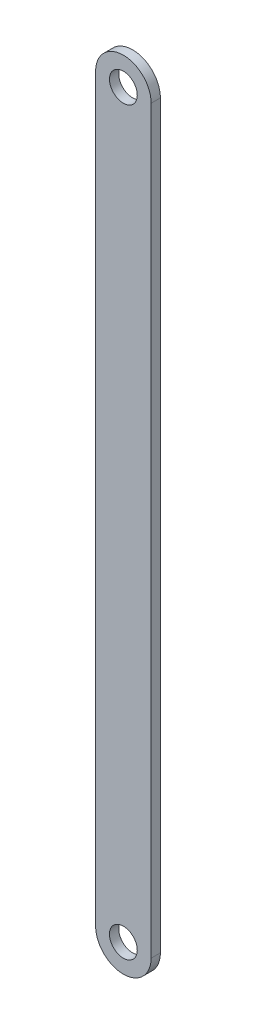
ISO-10303-21;
HEADER;
FILE_DESCRIPTION(('STEP AP214'),'2;1');
FILE_NAME('part.step','',(''),(''),'','','');
FILE_SCHEMA(('AUTOMOTIVE_DESIGN { 1 0 10303 214 1 1 1 1 }'));
ENDSEC;
DATA;
#1=APPLICATION_CONTEXT('core data for automotive mechanical design processes');
#2=APPLICATION_PROTOCOL_DEFINITION('international standard','automotive_design',2000,#1);
#3=PRODUCT_CONTEXT('',#1,'mechanical');
#4=PRODUCT('Part','Part','',(#3));
#5=PRODUCT_RELATED_PRODUCT_CATEGORY('part','',(#4));
#6=PRODUCT_DEFINITION_FORMATION('','',#4);
#7=PRODUCT_DEFINITION_CONTEXT('part definition',#1,'design');
#8=PRODUCT_DEFINITION('design','',#6,#7);
#9=PRODUCT_DEFINITION_SHAPE('','',#8);
#10=(LENGTH_UNIT() NAMED_UNIT(*) SI_UNIT(.MILLI.,.METRE.));
#11=(NAMED_UNIT(*) PLANE_ANGLE_UNIT() SI_UNIT($,.RADIAN.));
#12=(NAMED_UNIT(*) SI_UNIT($,.STERADIAN.) SOLID_ANGLE_UNIT());
#13=UNCERTAINTY_MEASURE_WITH_UNIT(LENGTH_MEASURE(1.E-05),#10,'distance_accuracy_value','');
#14=(GEOMETRIC_REPRESENTATION_CONTEXT(3) GLOBAL_UNCERTAINTY_ASSIGNED_CONTEXT((#13)) GLOBAL_UNIT_ASSIGNED_CONTEXT((#10,
#11,#12)) REPRESENTATION_CONTEXT('',''));
#15=CARTESIAN_POINT('',(0.,0.,0.));
#16=DIRECTION('',(0.,0.,1.));
#17=DIRECTION('',(1.,0.,0.));
#18=AXIS2_PLACEMENT_3D('',#15,#16,#17);
#19=CARTESIAN_POINT('',(0.,-160.01,2.));
#20=DIRECTION('',(0.,0.,-1.));
#21=DIRECTION('',(-1.,0.,0.));
#22=AXIS2_PLACEMENT_3D('',#19,#20,#21);
#23=PLANE('',#22);
#24=CARTESIAN_POINT('',(0.,-160.01,2.));
#25=DIRECTION('',(0.,0.,1.));
#26=DIRECTION('',(-1.,0.,0.));
#27=AXIS2_PLACEMENT_3D('',#24,#25,#26);
#28=CIRCLE('',#27,6.);
#29=CARTESIAN_POINT('',(-5.99999999999998,-160.01,2.));
#30=VERTEX_POINT('',#29);
#31=CARTESIAN_POINT('',(6.00000000000002,-160.01,2.));
#32=VERTEX_POINT('',#31);
#33=EDGE_CURVE('E85',#30,#32,#28,.T.);
#34=ORIENTED_EDGE('',*,*,#33,.T.);
#35=DIRECTION('',(0.,1.,0.));
#36=VECTOR('',#35,1.);
#37=CARTESIAN_POINT('',(6.00000000000002,0.,2.));
#38=LINE('',#37,#36);
#39=CARTESIAN_POINT('',(6.00000000000002,0.,2.));
#40=VERTEX_POINT('',#39);
#41=EDGE_CURVE('E80',#32,#40,#38,.T.);
#42=ORIENTED_EDGE('',*,*,#41,.T.);
#43=CARTESIAN_POINT('',(0.,0.,2.));
#44=DIRECTION('',(0.,0.,1.));
#45=DIRECTION('',(1.,0.,0.));
#46=AXIS2_PLACEMENT_3D('',#43,#44,#45);
#47=CIRCLE('',#46,6.00000000000002);
#48=CARTESIAN_POINT('',(-6.00000000000002,0.,2.));
#49=VERTEX_POINT('',#48);
#50=EDGE_CURVE('E83',#40,#49,#47,.T.);
#51=ORIENTED_EDGE('',*,*,#50,.T.);
#52=DIRECTION('',(0.,-1.,0.));
#53=VECTOR('',#52,1.);
#54=CARTESIAN_POINT('',(-5.99999999999998,-160.01,2.));
#55=LINE('',#54,#53);
#56=EDGE_CURVE('E50',#49,#30,#55,.T.);
#57=ORIENTED_EDGE('',*,*,#56,.T.);
#58=EDGE_LOOP('',(#34,#42,#51,#57));
#59=FACE_BOUND('',#58,.T.);
#60=CARTESIAN_POINT('',(0.,0.,2.));
#61=DIRECTION('',(0.,0.,1.));
#62=DIRECTION('',(1.,0.,0.));
#63=AXIS2_PLACEMENT_3D('',#60,#61,#62);
#64=CIRCLE('',#63,3.);
#65=CARTESIAN_POINT('',(3.,0.,2.));
#66=VERTEX_POINT('',#65);
#67=EDGE_CURVE('E100',#66,#66,#64,.T.);
#68=ORIENTED_EDGE('',*,*,#67,.F.);
#69=EDGE_LOOP('',(#68));
#70=FACE_BOUND('',#69,.T.);
#71=CARTESIAN_POINT('',(0.,-160.01,2.));
#72=DIRECTION('',(0.,0.,1.));
#73=DIRECTION('',(1.,0.,0.));
#74=AXIS2_PLACEMENT_3D('',#71,#72,#73);
#75=CIRCLE('',#74,3.);
#76=CARTESIAN_POINT('',(3.00000000000002,-160.01,2.));
#77=VERTEX_POINT('',#76);
#78=EDGE_CURVE('E115',#77,#77,#75,.T.);
#79=ORIENTED_EDGE('',*,*,#78,.F.);
#80=EDGE_LOOP('',(#79));
#81=FACE_BOUND('',#80,.T.);
#82=ADVANCED_FACE('F33',(#59,#70,#81),#23,.F.);
#83=CARTESIAN_POINT('',(0.,-160.01,0.));
#84=DIRECTION('',(0.,0.,-1.));
#85=DIRECTION('',(-1.,0.,0.));
#86=AXIS2_PLACEMENT_3D('',#83,#84,#85);
#87=PLANE('',#86);
#88=CARTESIAN_POINT('',(0.,0.,0.));
#89=DIRECTION('',(0.,0.,1.));
#90=DIRECTION('',(1.,0.,0.));
#91=AXIS2_PLACEMENT_3D('',#88,#89,#90);
#92=CIRCLE('',#91,3.);
#93=CARTESIAN_POINT('',(3.,0.,0.));
#94=VERTEX_POINT('',#93);
#95=EDGE_CURVE('E112',#94,#94,#92,.T.);
#96=ORIENTED_EDGE('',*,*,#95,.T.);
#97=EDGE_LOOP('',(#96));
#98=FACE_BOUND('',#97,.T.);
#99=CARTESIAN_POINT('',(0.,-160.01,0.));
#100=DIRECTION('',(0.,0.,1.));
#101=DIRECTION('',(-1.,0.,0.));
#102=AXIS2_PLACEMENT_3D('',#99,#100,#101);
#103=CIRCLE('',#102,6.);
#104=CARTESIAN_POINT('',(-5.99999999999998,-160.01,0.));
#105=VERTEX_POINT('',#104);
#106=CARTESIAN_POINT('',(6.00000000000002,-160.01,0.));
#107=VERTEX_POINT('',#106);
#108=EDGE_CURVE('E97',#105,#107,#103,.T.);
#109=ORIENTED_EDGE('',*,*,#108,.F.);
#110=DIRECTION('',(0.,-1.,0.));
#111=VECTOR('',#110,1.);
#112=CARTESIAN_POINT('',(-5.99999999999998,-160.01,0.));
#113=LINE('',#112,#111);
#114=CARTESIAN_POINT('',(-6.00000000000002,0.,0.));
#115=VERTEX_POINT('',#114);
#116=EDGE_CURVE('E73',#115,#105,#113,.T.);
#117=ORIENTED_EDGE('',*,*,#116,.F.);
#118=CARTESIAN_POINT('',(0.,0.,0.));
#119=DIRECTION('',(0.,0.,1.));
#120=DIRECTION('',(1.,0.,0.));
#121=AXIS2_PLACEMENT_3D('',#118,#119,#120);
#122=CIRCLE('',#121,6.00000000000002);
#123=CARTESIAN_POINT('',(6.00000000000002,0.,0.));
#124=VERTEX_POINT('',#123);
#125=EDGE_CURVE('E67',#124,#115,#122,.T.);
#126=ORIENTED_EDGE('',*,*,#125,.F.);
#127=DIRECTION('',(0.,1.,0.));
#128=VECTOR('',#127,1.);
#129=CARTESIAN_POINT('',(6.00000000000002,0.,0.));
#130=LINE('',#129,#128);
#131=EDGE_CURVE('E89',#107,#124,#130,.T.);
#132=ORIENTED_EDGE('',*,*,#131,.F.);
#133=EDGE_LOOP('',(#109,#117,#126,#132));
#134=FACE_BOUND('',#133,.T.);
#135=CARTESIAN_POINT('',(0.,-160.01,0.));
#136=DIRECTION('',(0.,0.,1.));
#137=DIRECTION('',(1.,0.,0.));
#138=AXIS2_PLACEMENT_3D('',#135,#136,#137);
#139=CIRCLE('',#138,3.);
#140=CARTESIAN_POINT('',(3.00000000000002,-160.01,0.));
#141=VERTEX_POINT('',#140);
#142=EDGE_CURVE('E118',#141,#141,#139,.T.);
#143=ORIENTED_EDGE('',*,*,#142,.T.);
#144=EDGE_LOOP('',(#143));
#145=FACE_BOUND('',#144,.T.);
#146=ADVANCED_FACE('F108',(#98,#134,#145),#87,.T.);
#147=CARTESIAN_POINT('',(0.,-160.01,2.));
#148=DIRECTION('',(0.,0.,-1.));
#149=DIRECTION('',(-1.,0.,0.));
#150=AXIS2_PLACEMENT_3D('',#147,#148,#149);
#151=CYLINDRICAL_SURFACE('',#150,6.);
#152=ORIENTED_EDGE('',*,*,#108,.T.);
#153=DIRECTION('',(0.,0.,-1.));
#154=VECTOR('',#153,1.);
#155=CARTESIAN_POINT('',(6.00000000000002,-160.01,2.));
#156=LINE('',#155,#154);
#157=EDGE_CURVE('E11',#32,#107,#156,.T.);
#158=ORIENTED_EDGE('',*,*,#157,.F.);
#159=ORIENTED_EDGE('',*,*,#33,.F.);
#160=DIRECTION('',(0.,0.,-1.));
#161=VECTOR('',#160,1.);
#162=CARTESIAN_POINT('',(-5.99999999999998,-160.01,2.));
#163=LINE('',#162,#161);
#164=EDGE_CURVE('E93',#30,#105,#163,.T.);
#165=ORIENTED_EDGE('',*,*,#164,.T.);
#166=EDGE_LOOP('',(#152,#158,#159,#165));
#167=FACE_BOUND('',#166,.T.);
#168=ADVANCED_FACE('F35',(#167),#151,.T.);
#169=CARTESIAN_POINT('',(6.00000000000002,0.,2.));
#170=DIRECTION('',(-1.,0.,0.));
#171=DIRECTION('',(0.,0.,1.));
#172=AXIS2_PLACEMENT_3D('',#169,#170,#171);
#173=PLANE('',#172);
#174=ORIENTED_EDGE('',*,*,#131,.T.);
#175=DIRECTION('',(0.,0.,-1.));
#176=VECTOR('',#175,1.);
#177=CARTESIAN_POINT('',(6.00000000000002,0.,2.));
#178=LINE('',#177,#176);
#179=EDGE_CURVE('E42',#40,#124,#178,.T.);
#180=ORIENTED_EDGE('',*,*,#179,.F.);
#181=ORIENTED_EDGE('',*,*,#41,.F.);
#182=ORIENTED_EDGE('',*,*,#157,.T.);
#183=EDGE_LOOP('',(#174,#180,#181,#182));
#184=FACE_BOUND('',#183,.T.);
#185=ADVANCED_FACE('F88',(#184),#173,.F.);
#186=CARTESIAN_POINT('',(0.,0.,2.));
#187=DIRECTION('',(0.,0.,-1.));
#188=DIRECTION('',(-1.,0.,0.));
#189=AXIS2_PLACEMENT_3D('',#186,#187,#188);
#190=CYLINDRICAL_SURFACE('',#189,6.00000000000002);
#191=ORIENTED_EDGE('',*,*,#125,.T.);
#192=DIRECTION('',(0.,0.,-1.));
#193=VECTOR('',#192,1.);
#194=CARTESIAN_POINT('',(-6.00000000000002,0.,2.));
#195=LINE('',#194,#193);
#196=EDGE_CURVE('E90',#49,#115,#195,.T.);
#197=ORIENTED_EDGE('',*,*,#196,.F.);
#198=ORIENTED_EDGE('',*,*,#50,.F.);
#199=ORIENTED_EDGE('',*,*,#179,.T.);
#200=EDGE_LOOP('',(#191,#197,#198,#199));
#201=FACE_BOUND('',#200,.T.);
#202=ADVANCED_FACE('F91',(#201),#190,.T.);
#203=CARTESIAN_POINT('',(-5.99999999999998,-160.01,2.));
#204=DIRECTION('',(1.,0.,0.));
#205=DIRECTION('',(0.,1.,0.));
#206=AXIS2_PLACEMENT_3D('',#203,#204,#205);
#207=PLANE('',#206);
#208=ORIENTED_EDGE('',*,*,#116,.T.);
#209=ORIENTED_EDGE('',*,*,#164,.F.);
#210=ORIENTED_EDGE('',*,*,#56,.F.);
#211=ORIENTED_EDGE('',*,*,#196,.T.);
#212=EDGE_LOOP('',(#208,#209,#210,#211));
#213=FACE_BOUND('',#212,.T.);
#214=ADVANCED_FACE('F105',(#213),#207,.F.);
#215=CARTESIAN_POINT('',(0.,0.,2.));
#216=DIRECTION('',(0.,0.,-1.));
#217=DIRECTION('',(-1.,0.,0.));
#218=AXIS2_PLACEMENT_3D('',#215,#216,#217);
#219=CYLINDRICAL_SURFACE('',#218,3.);
#220=ORIENTED_EDGE('',*,*,#67,.T.);
#221=EDGE_LOOP('',(#220));
#222=FACE_BOUND('',#221,.T.);
#223=ORIENTED_EDGE('',*,*,#95,.F.);
#224=EDGE_LOOP('',(#223));
#225=FACE_BOUND('',#224,.T.);
#226=ADVANCED_FACE('F135',(#222,#225),#219,.F.);
#227=CARTESIAN_POINT('',(0.,-160.01,2.));
#228=DIRECTION('',(0.,0.,-1.));
#229=DIRECTION('',(-1.,0.,0.));
#230=AXIS2_PLACEMENT_3D('',#227,#228,#229);
#231=CYLINDRICAL_SURFACE('',#230,3.);
#232=ORIENTED_EDGE('',*,*,#78,.T.);
#233=EDGE_LOOP('',(#232));
#234=FACE_BOUND('',#233,.T.);
#235=ORIENTED_EDGE('',*,*,#142,.F.);
#236=EDGE_LOOP('',(#235));
#237=FACE_BOUND('',#236,.T.);
#238=ADVANCED_FACE('F124',(#234,#237),#231,.F.);
#239=CLOSED_SHELL('',(#82,#146,#168,#185,#202,#214,#226,#238));
#240=MANIFOLD_SOLID_BREP('B2',#239);
#241=ADVANCED_BREP_SHAPE_REPRESENTATION('',(#18,#240),#14);
#242=SHAPE_DEFINITION_REPRESENTATION(#9,#241);
ENDSEC;
END-ISO-10303-21;
